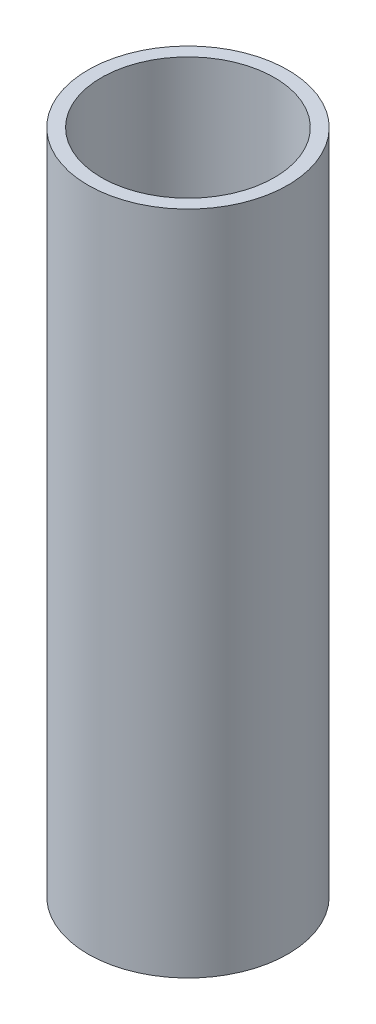
ISO-10303-21;
HEADER;
FILE_DESCRIPTION(('STEP AP214'),'2;1');
FILE_NAME('part.step','',(''),(''),'','','');
FILE_SCHEMA(('AUTOMOTIVE_DESIGN { 1 0 10303 214 1 1 1 1 }'));
ENDSEC;
DATA;
#1=APPLICATION_CONTEXT('core data for automotive mechanical design processes');
#2=APPLICATION_PROTOCOL_DEFINITION('international standard','automotive_design',2000,#1);
#3=PRODUCT_CONTEXT('',#1,'mechanical');
#4=PRODUCT('Part','Part','',(#3));
#5=PRODUCT_RELATED_PRODUCT_CATEGORY('part','',(#4));
#6=PRODUCT_DEFINITION_FORMATION('','',#4);
#7=PRODUCT_DEFINITION_CONTEXT('part definition',#1,'design');
#8=PRODUCT_DEFINITION('design','',#6,#7);
#9=PRODUCT_DEFINITION_SHAPE('','',#8);
#10=(LENGTH_UNIT() NAMED_UNIT(*) SI_UNIT(.MILLI.,.METRE.));
#11=(NAMED_UNIT(*) PLANE_ANGLE_UNIT() SI_UNIT($,.RADIAN.));
#12=(NAMED_UNIT(*) SI_UNIT($,.STERADIAN.) SOLID_ANGLE_UNIT());
#13=UNCERTAINTY_MEASURE_WITH_UNIT(LENGTH_MEASURE(1.E-05),#10,'distance_accuracy_value','');
#14=(GEOMETRIC_REPRESENTATION_CONTEXT(3) GLOBAL_UNCERTAINTY_ASSIGNED_CONTEXT((#13)) GLOBAL_UNIT_ASSIGNED_CONTEXT((#10,
#11,#12)) REPRESENTATION_CONTEXT('',''));
#15=CARTESIAN_POINT('',(0.,0.,0.));
#16=DIRECTION('',(0.,0.,1.));
#17=DIRECTION('',(1.,0.,0.));
#18=AXIS2_PLACEMENT_3D('',#15,#16,#17);
#19=CARTESIAN_POINT('',(0.,100.,0.));
#20=DIRECTION('',(0.,1.,0.));
#21=DIRECTION('',(0.,0.,1.));
#22=AXIS2_PLACEMENT_3D('',#19,#20,#21);
#23=PLANE('',#22);
#24=CARTESIAN_POINT('',(0.,100.,0.));
#25=DIRECTION('',(0.,1.,0.));
#26=DIRECTION('',(0.,0.,1.));
#27=AXIS2_PLACEMENT_3D('',#24,#25,#26);
#28=CIRCLE('',#27,15.);
#29=CARTESIAN_POINT('',(0.,100.,15.));
#30=VERTEX_POINT('',#29);
#31=EDGE_CURVE('E10',#30,#30,#28,.T.);
#32=ORIENTED_EDGE('',*,*,#31,.T.);
#33=EDGE_LOOP('',(#32));
#34=FACE_BOUND('',#33,.T.);
#35=CARTESIAN_POINT('',(0.,100.,0.));
#36=DIRECTION('',(0.,1.,0.));
#37=DIRECTION('',(0.,0.,1.));
#38=AXIS2_PLACEMENT_3D('',#35,#36,#37);
#39=CIRCLE('',#38,13.);
#40=CARTESIAN_POINT('',(0.,100.,13.));
#41=VERTEX_POINT('',#40);
#42=EDGE_CURVE('E50',#41,#41,#39,.T.);
#43=ORIENTED_EDGE('',*,*,#42,.F.);
#44=EDGE_LOOP('',(#43));
#45=FACE_BOUND('',#44,.T.);
#46=ADVANCED_FACE('F37',(#34,#45),#23,.T.);
#47=CARTESIAN_POINT('',(0.,0.,0.));
#48=DIRECTION('',(0.,1.,0.));
#49=DIRECTION('',(0.,0.,1.));
#50=AXIS2_PLACEMENT_3D('',#47,#48,#49);
#51=PLANE('',#50);
#52=CARTESIAN_POINT('',(0.,0.,0.));
#53=DIRECTION('',(0.,1.,0.));
#54=DIRECTION('',(0.,0.,1.));
#55=AXIS2_PLACEMENT_3D('',#52,#53,#54);
#56=CIRCLE('',#55,15.);
#57=CARTESIAN_POINT('',(0.,0.,15.));
#58=VERTEX_POINT('',#57);
#59=EDGE_CURVE('E41',#58,#58,#56,.T.);
#60=ORIENTED_EDGE('',*,*,#59,.F.);
#61=EDGE_LOOP('',(#60));
#62=FACE_BOUND('',#61,.T.);
#63=CARTESIAN_POINT('',(0.,0.,0.));
#64=DIRECTION('',(0.,1.,0.));
#65=DIRECTION('',(0.,0.,1.));
#66=AXIS2_PLACEMENT_3D('',#63,#64,#65);
#67=CIRCLE('',#66,13.);
#68=CARTESIAN_POINT('',(0.,0.,13.));
#69=VERTEX_POINT('',#68);
#70=EDGE_CURVE('E52',#69,#69,#67,.T.);
#71=ORIENTED_EDGE('',*,*,#70,.T.);
#72=EDGE_LOOP('',(#71));
#73=FACE_BOUND('',#72,.T.);
#74=ADVANCED_FACE('F64',(#62,#73),#51,.F.);
#75=CARTESIAN_POINT('',(0.,100.,0.));
#76=DIRECTION('',(0.,-1.,0.));
#77=DIRECTION('',(0.,0.,-1.));
#78=AXIS2_PLACEMENT_3D('',#75,#76,#77);
#79=CYLINDRICAL_SURFACE('',#78,15.);
#80=ORIENTED_EDGE('',*,*,#31,.F.);
#81=EDGE_LOOP('',(#80));
#82=FACE_BOUND('',#81,.T.);
#83=ORIENTED_EDGE('',*,*,#59,.T.);
#84=EDGE_LOOP('',(#83));
#85=FACE_BOUND('',#84,.T.);
#86=ADVANCED_FACE('F39',(#82,#85),#79,.T.);
#87=CARTESIAN_POINT('',(0.,100.,0.));
#88=DIRECTION('',(0.,-1.,0.));
#89=DIRECTION('',(0.,0.,-1.));
#90=AXIS2_PLACEMENT_3D('',#87,#88,#89);
#91=CYLINDRICAL_SURFACE('',#90,13.);
#92=ORIENTED_EDGE('',*,*,#42,.T.);
#93=EDGE_LOOP('',(#92));
#94=FACE_BOUND('',#93,.T.);
#95=ORIENTED_EDGE('',*,*,#70,.F.);
#96=EDGE_LOOP('',(#95));
#97=FACE_BOUND('',#96,.T.);
#98=ADVANCED_FACE('F60',(#94,#97),#91,.F.);
#99=CLOSED_SHELL('',(#46,#74,#86,#98));
#100=MANIFOLD_SOLID_BREP('B2',#99);
#101=ADVANCED_BREP_SHAPE_REPRESENTATION('',(#18,#100),#14);
#102=SHAPE_DEFINITION_REPRESENTATION(#9,#101);
ENDSEC;
END-ISO-10303-21;
